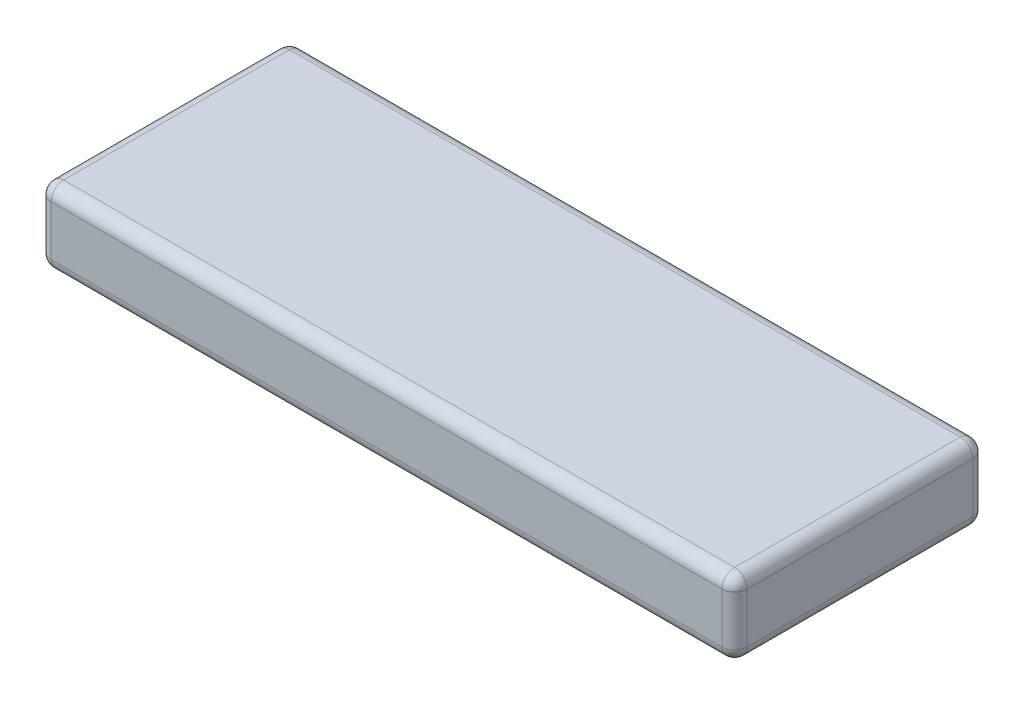
ISO-10303-21;
HEADER;
FILE_DESCRIPTION(('STEP AP214'),'2;1');
FILE_NAME('part.step','',(''),(''),'','','');
FILE_SCHEMA(('AUTOMOTIVE_DESIGN { 1 0 10303 214 1 1 1 1 }'));
ENDSEC;
DATA;
#1=APPLICATION_CONTEXT('core data for automotive mechanical design processes');
#2=APPLICATION_PROTOCOL_DEFINITION('international standard','automotive_design',2000,#1);
#3=PRODUCT_CONTEXT('',#1,'mechanical');
#4=PRODUCT('Part','Part','',(#3));
#5=PRODUCT_RELATED_PRODUCT_CATEGORY('part','',(#4));
#6=PRODUCT_DEFINITION_FORMATION('','',#4);
#7=PRODUCT_DEFINITION_CONTEXT('part definition',#1,'design');
#8=PRODUCT_DEFINITION('design','',#6,#7);
#9=PRODUCT_DEFINITION_SHAPE('','',#8);
#10=(LENGTH_UNIT() NAMED_UNIT(*) SI_UNIT(.MILLI.,.METRE.));
#11=(NAMED_UNIT(*) PLANE_ANGLE_UNIT() SI_UNIT($,.RADIAN.));
#12=(NAMED_UNIT(*) SI_UNIT($,.STERADIAN.) SOLID_ANGLE_UNIT());
#13=UNCERTAINTY_MEASURE_WITH_UNIT(LENGTH_MEASURE(1.E-05),#10,'distance_accuracy_value','');
#14=(GEOMETRIC_REPRESENTATION_CONTEXT(3) GLOBAL_UNCERTAINTY_ASSIGNED_CONTEXT((#13)) GLOBAL_UNIT_ASSIGNED_CONTEXT((#10,
#11,#12)) REPRESENTATION_CONTEXT('',''));
#15=CARTESIAN_POINT('',(0.,0.,0.));
#16=DIRECTION('',(0.,0.,1.));
#17=DIRECTION('',(1.,0.,0.));
#18=AXIS2_PLACEMENT_3D('',#15,#16,#17);
#19=CARTESIAN_POINT('',(0.,12.,0.));
#20=DIRECTION('',(1.,0.,0.));
#21=DIRECTION('',(0.,0.,-1.));
#22=AXIS2_PLACEMENT_3D('',#19,#20,#21);
#23=PLANE('',#22);
#24=DIRECTION('',(0.,0.,1.));
#25=VECTOR('',#24,1.);
#26=CARTESIAN_POINT('',(0.,2.,0.));
#27=LINE('',#26,#25);
#28=CARTESIAN_POINT('',(0.,2.,-38.));
#29=VERTEX_POINT('',#28);
#30=CARTESIAN_POINT('',(0.,2.,-2.));
#31=VERTEX_POINT('',#30);
#32=EDGE_CURVE('E241',#29,#31,#27,.T.);
#33=ORIENTED_EDGE('',*,*,#32,.T.);
#34=DIRECTION('',(0.,-1.,0.));
#35=VECTOR('',#34,1.);
#36=CARTESIAN_POINT('',(0.,12.,-2.));
#37=LINE('',#36,#35);
#38=CARTESIAN_POINT('',(0.,10.,-2.));
#39=VERTEX_POINT('',#38);
#40=EDGE_CURVE('E192',#31,#39,#37,.F.);
#41=ORIENTED_EDGE('',*,*,#40,.T.);
#42=DIRECTION('',(0.,0.,1.));
#43=VECTOR('',#42,1.);
#44=CARTESIAN_POINT('',(0.,10.,0.));
#45=LINE('',#44,#43);
#46=CARTESIAN_POINT('',(0.,10.,-38.));
#47=VERTEX_POINT('',#46);
#48=EDGE_CURVE('E238',#39,#47,#45,.F.);
#49=ORIENTED_EDGE('',*,*,#48,.T.);
#50=DIRECTION('',(0.,-1.,0.));
#51=VECTOR('',#50,1.);
#52=CARTESIAN_POINT('',(0.,12.,-38.));
#53=LINE('',#52,#51);
#54=EDGE_CURVE('E190',#47,#29,#53,.T.);
#55=ORIENTED_EDGE('',*,*,#54,.T.);
#56=EDGE_LOOP('',(#33,#41,#49,#55));
#57=FACE_BOUND('',#56,.T.);
#58=ADVANCED_FACE('F37',(#57),#23,.F.);
#59=CARTESIAN_POINT('',(0.,12.,0.));
#60=DIRECTION('',(0.,0.,-1.));
#61=DIRECTION('',(-1.,0.,0.));
#62=AXIS2_PLACEMENT_3D('',#59,#60,#61);
#63=PLANE('',#62);
#64=DIRECTION('',(1.,0.,0.));
#65=VECTOR('',#64,1.);
#66=CARTESIAN_POINT('',(0.,10.,0.));
#67=LINE('',#66,#65);
#68=CARTESIAN_POINT('',(109.,10.,0.));
#69=VERTEX_POINT('',#68);
#70=CARTESIAN_POINT('',(2.,10.,0.));
#71=VERTEX_POINT('',#70);
#72=EDGE_CURVE('E204',#69,#71,#67,.F.);
#73=ORIENTED_EDGE('',*,*,#72,.T.);
#74=DIRECTION('',(0.,-1.,0.));
#75=VECTOR('',#74,1.);
#76=CARTESIAN_POINT('',(2.,12.,0.));
#77=LINE('',#76,#75);
#78=CARTESIAN_POINT('',(2.,2.,0.));
#79=VERTEX_POINT('',#78);
#80=EDGE_CURVE('E188',#71,#79,#77,.T.);
#81=ORIENTED_EDGE('',*,*,#80,.T.);
#82=DIRECTION('',(1.,0.,0.));
#83=VECTOR('',#82,1.);
#84=CARTESIAN_POINT('',(111.,2.,0.));
#85=LINE('',#84,#83);
#86=CARTESIAN_POINT('',(109.,2.,0.));
#87=VERTEX_POINT('',#86);
#88=EDGE_CURVE('E136',#79,#87,#85,.T.);
#89=ORIENTED_EDGE('',*,*,#88,.T.);
#90=DIRECTION('',(0.,-1.,0.));
#91=VECTOR('',#90,1.);
#92=CARTESIAN_POINT('',(109.,12.,0.));
#93=LINE('',#92,#91);
#94=EDGE_CURVE('E186',#87,#69,#93,.F.);
#95=ORIENTED_EDGE('',*,*,#94,.T.);
#96=EDGE_LOOP('',(#73,#81,#89,#95));
#97=FACE_BOUND('',#96,.T.);
#98=ADVANCED_FACE('F266',(#97),#63,.F.);
#99=CARTESIAN_POINT('',(111.,12.,0.));
#100=DIRECTION('',(-1.,0.,0.));
#101=DIRECTION('',(0.,0.,1.));
#102=AXIS2_PLACEMENT_3D('',#99,#100,#101);
#103=PLANE('',#102);
#104=DIRECTION('',(0.,0.,-1.));
#105=VECTOR('',#104,1.);
#106=CARTESIAN_POINT('',(111.,2.,-40.));
#107=LINE('',#106,#105);
#108=CARTESIAN_POINT('',(111.,2.,-2.));
#109=VERTEX_POINT('',#108);
#110=CARTESIAN_POINT('',(111.,2.,-38.));
#111=VERTEX_POINT('',#110);
#112=EDGE_CURVE('E227',#109,#111,#107,.T.);
#113=ORIENTED_EDGE('',*,*,#112,.T.);
#114=DIRECTION('',(0.,-1.,0.));
#115=VECTOR('',#114,1.);
#116=CARTESIAN_POINT('',(111.,12.,-38.));
#117=LINE('',#116,#115);
#118=CARTESIAN_POINT('',(111.,10.,-38.));
#119=VERTEX_POINT('',#118);
#120=EDGE_CURVE('E11',#111,#119,#117,.F.);
#121=ORIENTED_EDGE('',*,*,#120,.T.);
#122=DIRECTION('',(0.,0.,-1.));
#123=VECTOR('',#122,1.);
#124=CARTESIAN_POINT('',(111.,10.,0.));
#125=LINE('',#124,#123);
#126=CARTESIAN_POINT('',(111.,10.,-2.));
#127=VERTEX_POINT('',#126);
#128=EDGE_CURVE('E160',#119,#127,#125,.F.);
#129=ORIENTED_EDGE('',*,*,#128,.T.);
#130=DIRECTION('',(0.,-1.,0.));
#131=VECTOR('',#130,1.);
#132=CARTESIAN_POINT('',(111.,12.,-2.));
#133=LINE('',#132,#131);
#134=EDGE_CURVE('E46',#127,#109,#133,.T.);
#135=ORIENTED_EDGE('',*,*,#134,.T.);
#136=EDGE_LOOP('',(#113,#121,#129,#135));
#137=FACE_BOUND('',#136,.T.);
#138=ADVANCED_FACE('F306',(#137),#103,.F.);
#139=CARTESIAN_POINT('',(0.,12.,-40.));
#140=DIRECTION('',(0.,0.,1.));
#141=DIRECTION('',(1.,0.,0.));
#142=AXIS2_PLACEMENT_3D('',#139,#140,#141);
#143=PLANE('',#142);
#144=DIRECTION('',(-1.,0.,0.));
#145=VECTOR('',#144,1.);
#146=CARTESIAN_POINT('',(0.,2.,-40.));
#147=LINE('',#146,#145);
#148=CARTESIAN_POINT('',(109.,2.,-40.));
#149=VERTEX_POINT('',#148);
#150=CARTESIAN_POINT('',(2.,2.,-40.));
#151=VERTEX_POINT('',#150);
#152=EDGE_CURVE('E232',#149,#151,#147,.T.);
#153=ORIENTED_EDGE('',*,*,#152,.T.);
#154=DIRECTION('',(0.,-1.,0.));
#155=VECTOR('',#154,1.);
#156=CARTESIAN_POINT('',(2.,12.,-40.));
#157=LINE('',#156,#155);
#158=CARTESIAN_POINT('',(2.,10.,-40.));
#159=VERTEX_POINT('',#158);
#160=EDGE_CURVE('E196',#151,#159,#157,.F.);
#161=ORIENTED_EDGE('',*,*,#160,.T.);
#162=DIRECTION('',(-1.,0.,0.));
#163=VECTOR('',#162,1.);
#164=CARTESIAN_POINT('',(0.,10.,-40.));
#165=LINE('',#164,#163);
#166=CARTESIAN_POINT('',(109.,10.,-40.));
#167=VERTEX_POINT('',#166);
#168=EDGE_CURVE('E229',#159,#167,#165,.F.);
#169=ORIENTED_EDGE('',*,*,#168,.T.);
#170=DIRECTION('',(0.,-1.,0.));
#171=VECTOR('',#170,1.);
#172=CARTESIAN_POINT('',(109.,12.,-40.));
#173=LINE('',#172,#171);
#174=EDGE_CURVE('E194',#167,#149,#173,.T.);
#175=ORIENTED_EDGE('',*,*,#174,.T.);
#176=EDGE_LOOP('',(#153,#161,#169,#175));
#177=FACE_BOUND('',#176,.T.);
#178=ADVANCED_FACE('F289',(#177),#143,.F.);
#179=CARTESIAN_POINT('',(0.,12.,0.));
#180=DIRECTION('',(0.,-1.,0.));
#181=DIRECTION('',(0.,0.,-1.));
#182=AXIS2_PLACEMENT_3D('',#179,#180,#181);
#183=PLANE('',#182);
#184=DIRECTION('',(0.,0.,-1.));
#185=VECTOR('',#184,1.);
#186=CARTESIAN_POINT('',(109.,12.,0.));
#187=LINE('',#186,#185);
#188=CARTESIAN_POINT('',(109.,12.,-2.));
#189=VERTEX_POINT('',#188);
#190=CARTESIAN_POINT('',(109.,12.,-38.));
#191=VERTEX_POINT('',#190);
#192=EDGE_CURVE('E249',#189,#191,#187,.T.);
#193=ORIENTED_EDGE('',*,*,#192,.T.);
#194=DIRECTION('',(-1.,0.,0.));
#195=VECTOR('',#194,1.);
#196=CARTESIAN_POINT('',(0.,12.,-38.));
#197=LINE('',#196,#195);
#198=CARTESIAN_POINT('',(2.,12.,-38.));
#199=VERTEX_POINT('',#198);
#200=EDGE_CURVE('E252',#191,#199,#197,.T.);
#201=ORIENTED_EDGE('',*,*,#200,.T.);
#202=DIRECTION('',(0.,0.,1.));
#203=VECTOR('',#202,1.);
#204=CARTESIAN_POINT('',(2.,12.,0.));
#205=LINE('',#204,#203);
#206=CARTESIAN_POINT('',(2.,12.,-2.));
#207=VERTEX_POINT('',#206);
#208=EDGE_CURVE('E243',#199,#207,#205,.T.);
#209=ORIENTED_EDGE('',*,*,#208,.T.);
#210=DIRECTION('',(1.,0.,0.));
#211=VECTOR('',#210,1.);
#212=CARTESIAN_POINT('',(0.,12.,-2.));
#213=LINE('',#212,#211);
#214=EDGE_CURVE('E246',#207,#189,#213,.T.);
#215=ORIENTED_EDGE('',*,*,#214,.T.);
#216=EDGE_LOOP('',(#193,#201,#209,#215));
#217=FACE_BOUND('',#216,.T.);
#218=ADVANCED_FACE('F315',(#217),#183,.F.);
#219=CARTESIAN_POINT('',(0.,0.,0.));
#220=DIRECTION('',(0.,-1.,0.));
#221=DIRECTION('',(0.,0.,-1.));
#222=AXIS2_PLACEMENT_3D('',#219,#220,#221);
#223=PLANE('',#222);
#224=DIRECTION('',(0.,0.,-1.));
#225=VECTOR('',#224,1.);
#226=CARTESIAN_POINT('',(109.,0.,0.));
#227=LINE('',#226,#225);
#228=CARTESIAN_POINT('',(109.,0.,-38.));
#229=VERTEX_POINT('',#228);
#230=CARTESIAN_POINT('',(109.,0.,-2.));
#231=VERTEX_POINT('',#230);
#232=EDGE_CURVE('E159',#229,#231,#227,.F.);
#233=ORIENTED_EDGE('',*,*,#232,.T.);
#234=DIRECTION('',(1.,0.,0.));
#235=VECTOR('',#234,1.);
#236=CARTESIAN_POINT('',(0.,0.,-2.));
#237=LINE('',#236,#235);
#238=CARTESIAN_POINT('',(2.,0.,-2.));
#239=VERTEX_POINT('',#238);
#240=EDGE_CURVE('E133',#231,#239,#237,.F.);
#241=ORIENTED_EDGE('',*,*,#240,.T.);
#242=DIRECTION('',(0.,0.,1.));
#243=VECTOR('',#242,1.);
#244=CARTESIAN_POINT('',(2.,0.,-40.));
#245=LINE('',#244,#243);
#246=CARTESIAN_POINT('',(2.,0.,-38.));
#247=VERTEX_POINT('',#246);
#248=EDGE_CURVE('E146',#239,#247,#245,.F.);
#249=ORIENTED_EDGE('',*,*,#248,.T.);
#250=DIRECTION('',(-1.,0.,0.));
#251=VECTOR('',#250,1.);
#252=CARTESIAN_POINT('',(111.,0.,-38.));
#253=LINE('',#252,#251);
#254=EDGE_CURVE('E155',#247,#229,#253,.F.);
#255=ORIENTED_EDGE('',*,*,#254,.T.);
#256=EDGE_LOOP('',(#233,#241,#249,#255));
#257=FACE_BOUND('',#256,.T.);
#258=ADVANCED_FACE('F158',(#257),#223,.T.);
#259=CARTESIAN_POINT('',(0.,2.,-38.));
#260=DIRECTION('',(1.,0.,0.));
#261=DIRECTION('',(0.,0.,-1.));
#262=AXIS2_PLACEMENT_3D('',#259,#260,#261);
#263=CYLINDRICAL_SURFACE('',#262,2.);
#264=ORIENTED_EDGE('',*,*,#254,.F.);
#265=CARTESIAN_POINT('',(2.,2.,-38.));
#266=DIRECTION('',(1.,0.,0.));
#267=DIRECTION('',(0.,0.,-1.));
#268=AXIS2_PLACEMENT_3D('',#265,#266,#267);
#269=CIRCLE('',#268,2.);
#270=EDGE_CURVE('E176',#247,#151,#269,.T.);
#271=ORIENTED_EDGE('',*,*,#270,.T.);
#272=ORIENTED_EDGE('',*,*,#152,.F.);
#273=CARTESIAN_POINT('',(109.,2.,-38.));
#274=DIRECTION('',(1.,0.,0.));
#275=DIRECTION('',(0.,0.,-1.));
#276=AXIS2_PLACEMENT_3D('',#273,#274,#275);
#277=CIRCLE('',#276,2.);
#278=EDGE_CURVE('E174',#149,#229,#277,.F.);
#279=ORIENTED_EDGE('',*,*,#278,.T.);
#280=EDGE_LOOP('',(#264,#271,#272,#279));
#281=FACE_BOUND('',#280,.T.);
#282=ADVANCED_FACE('F275',(#281),#263,.T.);
#283=CARTESIAN_POINT('',(2.,2.,0.));
#284=DIRECTION('',(0.,0.,-1.));
#285=DIRECTION('',(-1.,0.,0.));
#286=AXIS2_PLACEMENT_3D('',#283,#284,#285);
#287=CYLINDRICAL_SURFACE('',#286,2.);
#288=ORIENTED_EDGE('',*,*,#248,.F.);
#289=CARTESIAN_POINT('',(2.,2.,-2.));
#290=DIRECTION('',(0.,0.,-1.));
#291=DIRECTION('',(-1.,0.,0.));
#292=AXIS2_PLACEMENT_3D('',#289,#290,#291);
#293=CIRCLE('',#292,2.);
#294=EDGE_CURVE('E149',#239,#31,#293,.T.);
#295=ORIENTED_EDGE('',*,*,#294,.T.);
#296=ORIENTED_EDGE('',*,*,#32,.F.);
#297=CARTESIAN_POINT('',(2.,2.,-38.));
#298=DIRECTION('',(0.,0.,-1.));
#299=DIRECTION('',(-1.,0.,0.));
#300=AXIS2_PLACEMENT_3D('',#297,#298,#299);
#301=CIRCLE('',#300,2.);
#302=EDGE_CURVE('E141',#29,#247,#301,.F.);
#303=ORIENTED_EDGE('',*,*,#302,.T.);
#304=EDGE_LOOP('',(#288,#295,#296,#303));
#305=FACE_BOUND('',#304,.T.);
#306=ADVANCED_FACE('F147',(#305),#287,.T.);
#307=CARTESIAN_POINT('',(109.,2.,0.));
#308=DIRECTION('',(0.,0.,1.));
#309=DIRECTION('',(1.,0.,0.));
#310=AXIS2_PLACEMENT_3D('',#307,#308,#309);
#311=CYLINDRICAL_SURFACE('',#310,2.);
#312=ORIENTED_EDGE('',*,*,#232,.F.);
#313=CARTESIAN_POINT('',(109.,2.,-38.));
#314=DIRECTION('',(0.,0.,1.));
#315=DIRECTION('',(1.,0.,0.));
#316=AXIS2_PLACEMENT_3D('',#313,#314,#315);
#317=CIRCLE('',#316,2.);
#318=EDGE_CURVE('E54',#229,#111,#317,.T.);
#319=ORIENTED_EDGE('',*,*,#318,.T.);
#320=ORIENTED_EDGE('',*,*,#112,.F.);
#321=CARTESIAN_POINT('',(109.,2.,-2.));
#322=DIRECTION('',(0.,0.,1.));
#323=DIRECTION('',(1.,0.,0.));
#324=AXIS2_PLACEMENT_3D('',#321,#322,#323);
#325=CIRCLE('',#324,2.);
#326=EDGE_CURVE('E183',#109,#231,#325,.F.);
#327=ORIENTED_EDGE('',*,*,#326,.T.);
#328=EDGE_LOOP('',(#312,#319,#320,#327));
#329=FACE_BOUND('',#328,.T.);
#330=ADVANCED_FACE('F226',(#329),#311,.T.);
#331=CARTESIAN_POINT('',(0.,2.,-2.));
#332=DIRECTION('',(-1.,0.,0.));
#333=DIRECTION('',(0.,0.,1.));
#334=AXIS2_PLACEMENT_3D('',#331,#332,#333);
#335=CYLINDRICAL_SURFACE('',#334,2.);
#336=ORIENTED_EDGE('',*,*,#88,.F.);
#337=CARTESIAN_POINT('',(2.,2.,-2.));
#338=DIRECTION('',(-1.,0.,0.));
#339=DIRECTION('',(0.,0.,1.));
#340=AXIS2_PLACEMENT_3D('',#337,#338,#339);
#341=CIRCLE('',#340,2.);
#342=EDGE_CURVE('E129',#79,#239,#341,.F.);
#343=ORIENTED_EDGE('',*,*,#342,.T.);
#344=ORIENTED_EDGE('',*,*,#240,.F.);
#345=CARTESIAN_POINT('',(109.,2.,-2.));
#346=DIRECTION('',(-1.,0.,0.));
#347=DIRECTION('',(0.,0.,1.));
#348=AXIS2_PLACEMENT_3D('',#345,#346,#347);
#349=CIRCLE('',#348,2.);
#350=EDGE_CURVE('E142',#231,#87,#349,.T.);
#351=ORIENTED_EDGE('',*,*,#350,.T.);
#352=EDGE_LOOP('',(#336,#343,#344,#351));
#353=FACE_BOUND('',#352,.T.);
#354=ADVANCED_FACE('F131',(#353),#335,.T.);
#355=CARTESIAN_POINT('',(0.,10.,-2.));
#356=DIRECTION('',(1.,0.,0.));
#357=DIRECTION('',(0.,0.,-1.));
#358=AXIS2_PLACEMENT_3D('',#355,#356,#357);
#359=CYLINDRICAL_SURFACE('',#358,2.);
#360=ORIENTED_EDGE('',*,*,#214,.F.);
#361=CARTESIAN_POINT('',(2.,10.,-2.));
#362=DIRECTION('',(1.,0.,0.));
#363=DIRECTION('',(0.,0.,-1.));
#364=AXIS2_PLACEMENT_3D('',#361,#362,#363);
#365=CIRCLE('',#364,2.);
#366=EDGE_CURVE('E262',#207,#71,#365,.T.);
#367=ORIENTED_EDGE('',*,*,#366,.T.);
#368=ORIENTED_EDGE('',*,*,#72,.F.);
#369=CARTESIAN_POINT('',(109.,10.,-2.));
#370=DIRECTION('',(1.,0.,0.));
#371=DIRECTION('',(0.,0.,-1.));
#372=AXIS2_PLACEMENT_3D('',#369,#370,#371);
#373=CIRCLE('',#372,2.);
#374=EDGE_CURVE('E260',#69,#189,#373,.F.);
#375=ORIENTED_EDGE('',*,*,#374,.T.);
#376=EDGE_LOOP('',(#360,#367,#368,#375));
#377=FACE_BOUND('',#376,.T.);
#378=ADVANCED_FACE('F313',(#377),#359,.T.);
#379=CARTESIAN_POINT('',(109.,10.,0.));
#380=DIRECTION('',(0.,0.,-1.));
#381=DIRECTION('',(-1.,0.,0.));
#382=AXIS2_PLACEMENT_3D('',#379,#380,#381);
#383=CYLINDRICAL_SURFACE('',#382,2.);
#384=ORIENTED_EDGE('',*,*,#128,.F.);
#385=CARTESIAN_POINT('',(109.,10.,-38.));
#386=DIRECTION('',(0.,0.,-1.));
#387=DIRECTION('',(-1.,0.,0.));
#388=AXIS2_PLACEMENT_3D('',#385,#386,#387);
#389=CIRCLE('',#388,2.);
#390=EDGE_CURVE('E181',#119,#191,#389,.F.);
#391=ORIENTED_EDGE('',*,*,#390,.T.);
#392=ORIENTED_EDGE('',*,*,#192,.F.);
#393=CARTESIAN_POINT('',(109.,10.,-2.));
#394=DIRECTION('',(0.,0.,-1.));
#395=DIRECTION('',(-1.,0.,0.));
#396=AXIS2_PLACEMENT_3D('',#393,#394,#395);
#397=CIRCLE('',#396,2.);
#398=EDGE_CURVE('E178',#189,#127,#397,.T.);
#399=ORIENTED_EDGE('',*,*,#398,.T.);
#400=EDGE_LOOP('',(#384,#391,#392,#399));
#401=FACE_BOUND('',#400,.T.);
#402=ADVANCED_FACE('F308',(#401),#383,.T.);
#403=CARTESIAN_POINT('',(2.,10.,0.));
#404=DIRECTION('',(0.,0.,1.));
#405=DIRECTION('',(1.,0.,0.));
#406=AXIS2_PLACEMENT_3D('',#403,#404,#405);
#407=CYLINDRICAL_SURFACE('',#406,2.);
#408=ORIENTED_EDGE('',*,*,#48,.F.);
#409=CARTESIAN_POINT('',(2.,10.,-2.));
#410=DIRECTION('',(0.,0.,1.));
#411=DIRECTION('',(1.,0.,0.));
#412=AXIS2_PLACEMENT_3D('',#409,#410,#411);
#413=CIRCLE('',#412,2.);
#414=EDGE_CURVE('E257',#39,#207,#413,.F.);
#415=ORIENTED_EDGE('',*,*,#414,.T.);
#416=ORIENTED_EDGE('',*,*,#208,.F.);
#417=CARTESIAN_POINT('',(2.,10.,-38.));
#418=DIRECTION('',(0.,0.,1.));
#419=DIRECTION('',(1.,0.,0.));
#420=AXIS2_PLACEMENT_3D('',#417,#418,#419);
#421=CIRCLE('',#420,2.);
#422=EDGE_CURVE('E255',#199,#47,#421,.T.);
#423=ORIENTED_EDGE('',*,*,#422,.T.);
#424=EDGE_LOOP('',(#408,#415,#416,#423));
#425=FACE_BOUND('',#424,.T.);
#426=ADVANCED_FACE('F318',(#425),#407,.T.);
#427=CARTESIAN_POINT('',(0.,10.,-38.));
#428=DIRECTION('',(-1.,0.,0.));
#429=DIRECTION('',(0.,0.,1.));
#430=AXIS2_PLACEMENT_3D('',#427,#428,#429);
#431=CYLINDRICAL_SURFACE('',#430,2.);
#432=ORIENTED_EDGE('',*,*,#168,.F.);
#433=CARTESIAN_POINT('',(2.,10.,-38.));
#434=DIRECTION('',(-1.,0.,0.));
#435=DIRECTION('',(0.,0.,1.));
#436=AXIS2_PLACEMENT_3D('',#433,#434,#435);
#437=CIRCLE('',#436,2.);
#438=EDGE_CURVE('E168',#159,#199,#437,.F.);
#439=ORIENTED_EDGE('',*,*,#438,.T.);
#440=ORIENTED_EDGE('',*,*,#200,.F.);
#441=CARTESIAN_POINT('',(109.,10.,-38.));
#442=DIRECTION('',(-1.,0.,0.));
#443=DIRECTION('',(0.,0.,1.));
#444=AXIS2_PLACEMENT_3D('',#441,#442,#443);
#445=CIRCLE('',#444,2.);
#446=EDGE_CURVE('E165',#191,#167,#445,.T.);
#447=ORIENTED_EDGE('',*,*,#446,.T.);
#448=EDGE_LOOP('',(#432,#439,#440,#447));
#449=FACE_BOUND('',#448,.T.);
#450=ADVANCED_FACE('F291',(#449),#431,.T.);
#451=CARTESIAN_POINT('',(2.,2.,-2.));
#452=DIRECTION('',(0.,0.,1.));
#453=DIRECTION('',(1.,0.,0.));
#454=AXIS2_PLACEMENT_3D('',#451,#452,#453);
#455=SPHERICAL_SURFACE('',#454,2.);
#456=ORIENTED_EDGE('',*,*,#294,.F.);
#457=ORIENTED_EDGE('',*,*,#342,.F.);
#458=CARTESIAN_POINT('',(2.,2.,-2.));
#459=DIRECTION('',(0.,1.,0.));
#460=DIRECTION('',(0.,0.,1.));
#461=AXIS2_PLACEMENT_3D('',#458,#459,#460);
#462=CIRCLE('',#461,2.);
#463=EDGE_CURVE('E163',#31,#79,#462,.T.);
#464=ORIENTED_EDGE('',*,*,#463,.F.);
#465=EDGE_LOOP('',(#456,#457,#464));
#466=FACE_BOUND('',#465,.T.);
#467=ADVANCED_FACE('F162',(#466),#455,.T.);
#468=CARTESIAN_POINT('',(2.,12.,-2.));
#469=DIRECTION('',(0.,-1.,0.));
#470=DIRECTION('',(0.,0.,-1.));
#471=AXIS2_PLACEMENT_3D('',#468,#469,#470);
#472=CYLINDRICAL_SURFACE('',#471,2.);
#473=ORIENTED_EDGE('',*,*,#463,.T.);
#474=ORIENTED_EDGE('',*,*,#80,.F.);
#475=CARTESIAN_POINT('',(2.,10.,-2.));
#476=DIRECTION('',(0.,1.,0.));
#477=DIRECTION('',(0.,0.,1.));
#478=AXIS2_PLACEMENT_3D('',#475,#476,#477);
#479=CIRCLE('',#478,2.);
#480=EDGE_CURVE('E199',#39,#71,#479,.T.);
#481=ORIENTED_EDGE('',*,*,#480,.F.);
#482=ORIENTED_EDGE('',*,*,#40,.F.);
#483=EDGE_LOOP('',(#473,#474,#481,#482));
#484=FACE_BOUND('',#483,.T.);
#485=ADVANCED_FACE('F324',(#484),#472,.T.);
#486=CARTESIAN_POINT('',(2.,10.,-2.));
#487=DIRECTION('',(0.,0.,1.));
#488=DIRECTION('',(1.,0.,0.));
#489=AXIS2_PLACEMENT_3D('',#486,#487,#488);
#490=SPHERICAL_SURFACE('',#489,2.);
#491=ORIENTED_EDGE('',*,*,#480,.T.);
#492=ORIENTED_EDGE('',*,*,#366,.F.);
#493=ORIENTED_EDGE('',*,*,#414,.F.);
#494=EDGE_LOOP('',(#491,#492,#493));
#495=FACE_BOUND('',#494,.T.);
#496=ADVANCED_FACE('F322',(#495),#490,.T.);
#497=CARTESIAN_POINT('',(2.,2.,-38.));
#498=DIRECTION('',(0.,0.,1.));
#499=DIRECTION('',(1.,0.,0.));
#500=AXIS2_PLACEMENT_3D('',#497,#498,#499);
#501=SPHERICAL_SURFACE('',#500,2.);
#502=ORIENTED_EDGE('',*,*,#270,.F.);
#503=ORIENTED_EDGE('',*,*,#302,.F.);
#504=CARTESIAN_POINT('',(2.,2.,-38.));
#505=DIRECTION('',(0.,1.,0.));
#506=DIRECTION('',(0.,0.,1.));
#507=AXIS2_PLACEMENT_3D('',#504,#505,#506);
#508=CIRCLE('',#507,2.);
#509=EDGE_CURVE('E202',#151,#29,#508,.T.);
#510=ORIENTED_EDGE('',*,*,#509,.F.);
#511=EDGE_LOOP('',(#502,#503,#510));
#512=FACE_BOUND('',#511,.T.);
#513=ADVANCED_FACE('F280',(#512),#501,.T.);
#514=CARTESIAN_POINT('',(2.,12.,-38.));
#515=DIRECTION('',(0.,-1.,0.));
#516=DIRECTION('',(0.,0.,-1.));
#517=AXIS2_PLACEMENT_3D('',#514,#515,#516);
#518=CYLINDRICAL_SURFACE('',#517,2.);
#519=ORIENTED_EDGE('',*,*,#509,.T.);
#520=ORIENTED_EDGE('',*,*,#54,.F.);
#521=CARTESIAN_POINT('',(2.,10.,-38.));
#522=DIRECTION('',(0.,1.,0.));
#523=DIRECTION('',(0.,0.,1.));
#524=AXIS2_PLACEMENT_3D('',#521,#522,#523);
#525=CIRCLE('',#524,2.);
#526=EDGE_CURVE('E205',#159,#47,#525,.T.);
#527=ORIENTED_EDGE('',*,*,#526,.F.);
#528=ORIENTED_EDGE('',*,*,#160,.F.);
#529=EDGE_LOOP('',(#519,#520,#527,#528));
#530=FACE_BOUND('',#529,.T.);
#531=ADVANCED_FACE('F285',(#530),#518,.T.);
#532=CARTESIAN_POINT('',(2.,10.,-38.));
#533=DIRECTION('',(0.,0.,1.));
#534=DIRECTION('',(1.,0.,0.));
#535=AXIS2_PLACEMENT_3D('',#532,#533,#534);
#536=SPHERICAL_SURFACE('',#535,2.);
#537=ORIENTED_EDGE('',*,*,#526,.T.);
#538=ORIENTED_EDGE('',*,*,#422,.F.);
#539=ORIENTED_EDGE('',*,*,#438,.F.);
#540=EDGE_LOOP('',(#537,#538,#539));
#541=FACE_BOUND('',#540,.T.);
#542=ADVANCED_FACE('F327',(#541),#536,.T.);
#543=CARTESIAN_POINT('',(109.,2.,-38.));
#544=DIRECTION('',(0.,0.,1.));
#545=DIRECTION('',(1.,0.,0.));
#546=AXIS2_PLACEMENT_3D('',#543,#544,#545);
#547=SPHERICAL_SURFACE('',#546,2.);
#548=ORIENTED_EDGE('',*,*,#318,.F.);
#549=ORIENTED_EDGE('',*,*,#278,.F.);
#550=CARTESIAN_POINT('',(109.,2.,-38.));
#551=DIRECTION('',(0.,1.,0.));
#552=DIRECTION('',(0.,0.,1.));
#553=AXIS2_PLACEMENT_3D('',#550,#551,#552);
#554=CIRCLE('',#553,2.);
#555=EDGE_CURVE('E208',#111,#149,#554,.T.);
#556=ORIENTED_EDGE('',*,*,#555,.F.);
#557=EDGE_LOOP('',(#548,#549,#556));
#558=FACE_BOUND('',#557,.T.);
#559=ADVANCED_FACE('F304',(#558),#547,.T.);
#560=CARTESIAN_POINT('',(109.,12.,-38.));
#561=DIRECTION('',(0.,-1.,0.));
#562=DIRECTION('',(0.,0.,-1.));
#563=AXIS2_PLACEMENT_3D('',#560,#561,#562);
#564=CYLINDRICAL_SURFACE('',#563,2.);
#565=ORIENTED_EDGE('',*,*,#555,.T.);
#566=ORIENTED_EDGE('',*,*,#174,.F.);
#567=CARTESIAN_POINT('',(109.,10.,-38.));
#568=DIRECTION('',(0.,1.,0.));
#569=DIRECTION('',(0.,0.,1.));
#570=AXIS2_PLACEMENT_3D('',#567,#568,#569);
#571=CIRCLE('',#570,2.);
#572=EDGE_CURVE('E211',#119,#167,#571,.T.);
#573=ORIENTED_EDGE('',*,*,#572,.F.);
#574=ORIENTED_EDGE('',*,*,#120,.F.);
#575=EDGE_LOOP('',(#565,#566,#573,#574));
#576=FACE_BOUND('',#575,.T.);
#577=ADVANCED_FACE('F302',(#576),#564,.T.);
#578=CARTESIAN_POINT('',(109.,10.,-38.));
#579=DIRECTION('',(0.,0.,1.));
#580=DIRECTION('',(1.,0.,0.));
#581=AXIS2_PLACEMENT_3D('',#578,#579,#580);
#582=SPHERICAL_SURFACE('',#581,2.);
#583=ORIENTED_EDGE('',*,*,#446,.F.);
#584=ORIENTED_EDGE('',*,*,#390,.F.);
#585=ORIENTED_EDGE('',*,*,#572,.T.);
#586=EDGE_LOOP('',(#583,#584,#585));
#587=FACE_BOUND('',#586,.T.);
#588=ADVANCED_FACE('F297',(#587),#582,.T.);
#589=CARTESIAN_POINT('',(109.,2.,-2.));
#590=DIRECTION('',(0.,0.,1.));
#591=DIRECTION('',(1.,0.,0.));
#592=AXIS2_PLACEMENT_3D('',#589,#590,#591);
#593=SPHERICAL_SURFACE('',#592,2.);
#594=ORIENTED_EDGE('',*,*,#350,.F.);
#595=ORIENTED_EDGE('',*,*,#326,.F.);
#596=CARTESIAN_POINT('',(109.,2.,-2.));
#597=DIRECTION('',(0.,1.,0.));
#598=DIRECTION('',(0.,0.,1.));
#599=AXIS2_PLACEMENT_3D('',#596,#597,#598);
#600=CIRCLE('',#599,2.);
#601=EDGE_CURVE('E41',#87,#109,#600,.T.);
#602=ORIENTED_EDGE('',*,*,#601,.F.);
#603=EDGE_LOOP('',(#594,#595,#602));
#604=FACE_BOUND('',#603,.T.);
#605=ADVANCED_FACE('F39',(#604),#593,.T.);
#606=CARTESIAN_POINT('',(109.,12.,-2.));
#607=DIRECTION('',(0.,-1.,0.));
#608=DIRECTION('',(0.,0.,-1.));
#609=AXIS2_PLACEMENT_3D('',#606,#607,#608);
#610=CYLINDRICAL_SURFACE('',#609,2.);
#611=ORIENTED_EDGE('',*,*,#601,.T.);
#612=ORIENTED_EDGE('',*,*,#134,.F.);
#613=CARTESIAN_POINT('',(109.,10.,-2.));
#614=DIRECTION('',(0.,1.,0.));
#615=DIRECTION('',(0.,0.,1.));
#616=AXIS2_PLACEMENT_3D('',#613,#614,#615);
#617=CIRCLE('',#616,2.);
#618=EDGE_CURVE('E214',#69,#127,#617,.T.);
#619=ORIENTED_EDGE('',*,*,#618,.F.);
#620=ORIENTED_EDGE('',*,*,#94,.F.);
#621=EDGE_LOOP('',(#611,#612,#619,#620));
#622=FACE_BOUND('',#621,.T.);
#623=ADVANCED_FACE('F223',(#622),#610,.T.);
#624=CARTESIAN_POINT('',(109.,10.,-2.));
#625=DIRECTION('',(0.,0.,1.));
#626=DIRECTION('',(1.,0.,0.));
#627=AXIS2_PLACEMENT_3D('',#624,#625,#626);
#628=SPHERICAL_SURFACE('',#627,2.);
#629=ORIENTED_EDGE('',*,*,#398,.F.);
#630=ORIENTED_EDGE('',*,*,#374,.F.);
#631=ORIENTED_EDGE('',*,*,#618,.T.);
#632=EDGE_LOOP('',(#629,#630,#631));
#633=FACE_BOUND('',#632,.T.);
#634=ADVANCED_FACE('F310',(#633),#628,.T.);
#635=CLOSED_SHELL('',(#58,#98,#138,#178,#218,#258,#282,#306,#330,#354,#378,#402,#426,#450,#467,
#485,#496,#513,#531,#542,#559,#577,#588,#605,#623,#634));
#636=MANIFOLD_SOLID_BREP('B2',#635);
#637=ADVANCED_BREP_SHAPE_REPRESENTATION('',(#18,#636),#14);
#638=SHAPE_DEFINITION_REPRESENTATION(#9,#637);
ENDSEC;
END-ISO-10303-21;
